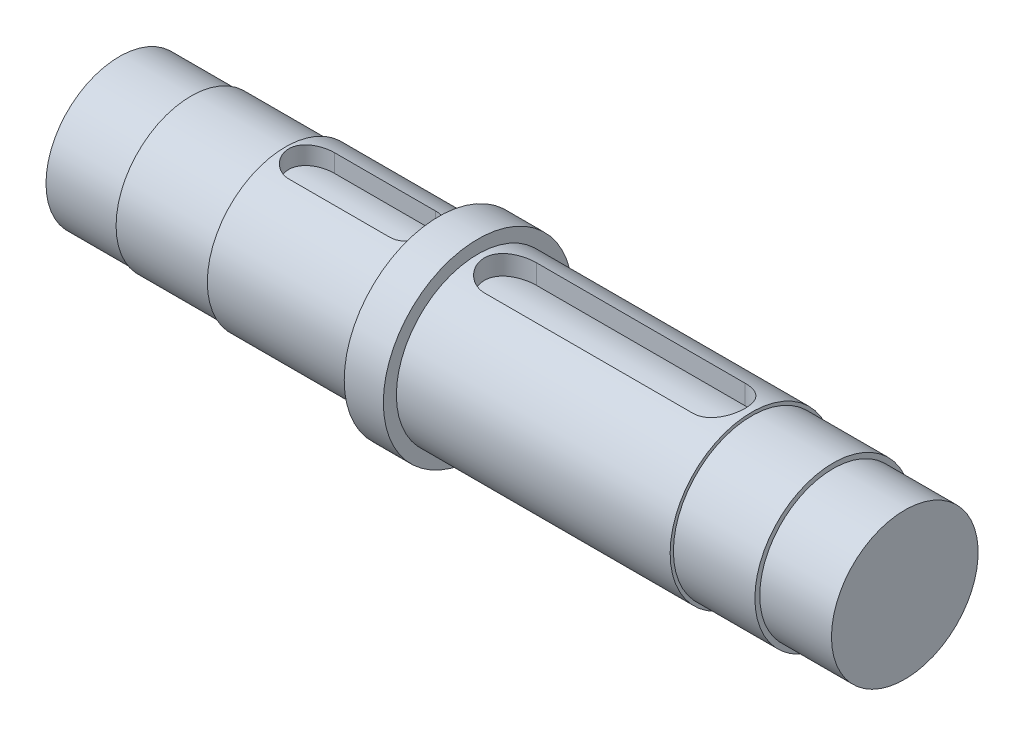
ISO-10303-21;
HEADER;
FILE_DESCRIPTION(('STEP AP214'),'2;1');
FILE_NAME('part.step','',(''),(''),'','','');
FILE_SCHEMA(('AUTOMOTIVE_DESIGN { 1 0 10303 214 1 1 1 1 }'));
ENDSEC;
DATA;
#1=APPLICATION_CONTEXT('core data for automotive mechanical design processes');
#2=APPLICATION_PROTOCOL_DEFINITION('international standard','automotive_design',2000,#1);
#3=PRODUCT_CONTEXT('',#1,'mechanical');
#4=PRODUCT('Part','Part','',(#3));
#5=PRODUCT_RELATED_PRODUCT_CATEGORY('part','',(#4));
#6=PRODUCT_DEFINITION_FORMATION('','',#4);
#7=PRODUCT_DEFINITION_CONTEXT('part definition',#1,'design');
#8=PRODUCT_DEFINITION('design','',#6,#7);
#9=PRODUCT_DEFINITION_SHAPE('','',#8);
#10=(LENGTH_UNIT() NAMED_UNIT(*) SI_UNIT(.MILLI.,.METRE.));
#11=(NAMED_UNIT(*) PLANE_ANGLE_UNIT() SI_UNIT($,.RADIAN.));
#12=(NAMED_UNIT(*) SI_UNIT($,.STERADIAN.) SOLID_ANGLE_UNIT());
#13=UNCERTAINTY_MEASURE_WITH_UNIT(LENGTH_MEASURE(1.E-05),#10,'distance_accuracy_value','');
#14=(GEOMETRIC_REPRESENTATION_CONTEXT(3) GLOBAL_UNCERTAINTY_ASSIGNED_CONTEXT((#13)) GLOBAL_UNIT_ASSIGNED_CONTEXT((#10,
#11,#12)) REPRESENTATION_CONTEXT('',''));
#15=CARTESIAN_POINT('',(0.,0.,0.));
#16=DIRECTION('',(0.,0.,1.));
#17=DIRECTION('',(1.,0.,0.));
#18=AXIS2_PLACEMENT_3D('',#15,#16,#17);
#19=CARTESIAN_POINT('',(-91.2740565726129,0.,0.));
#20=DIRECTION('',(-1.,0.,0.));
#21=DIRECTION('',(0.,0.,1.));
#22=AXIS2_PLACEMENT_3D('',#19,#20,#21);
#23=CYLINDRICAL_SURFACE('',#22,24.);
#24=CARTESIAN_POINT('',(95.,0.,0.));
#25=DIRECTION('',(-1.,0.,0.));
#26=DIRECTION('',(0.,0.,1.));
#27=AXIS2_PLACEMENT_3D('',#24,#25,#26);
#28=CIRCLE('',#27,24.);
#29=CARTESIAN_POINT('',(95.,0.,24.));
#30=VERTEX_POINT('',#29);
#31=EDGE_CURVE('E331',#30,#30,#28,.T.);
#32=ORIENTED_EDGE('',*,*,#31,.T.);
#33=EDGE_LOOP('',(#32));
#34=FACE_BOUND('',#33,.T.);
#35=CARTESIAN_POINT('',(48.,0.,0.));
#36=DIRECTION('',(-1.,0.,0.));
#37=DIRECTION('',(0.,0.,1.));
#38=AXIS2_PLACEMENT_3D('',#35,#36,#37);
#39=CIRCLE('',#38,24.);
#40=CARTESIAN_POINT('',(48.,0.,24.));
#41=VERTEX_POINT('',#40);
#42=EDGE_CURVE('E340',#41,#41,#39,.T.);
#43=ORIENTED_EDGE('',*,*,#42,.F.);
#44=EDGE_LOOP('',(#43));
#45=FACE_BOUND('',#44,.T.);
#46=CARTESIAN_POINT('',(87.,22.956480566498,7.));
#47=CARTESIAN_POINT('',(87.9301846172722,22.956480566498,7.));
#48=CARTESIAN_POINT('',(88.842386550896,23.0149523823366,6.81509831079665));
#49=CARTESIAN_POINT('',(90.5347737208252,23.2118131608828,6.11108238623154));
#50=CARTESIAN_POINT('',(91.3077238076955,23.3487244542818,5.59170049891049));
#51=CARTESIAN_POINT('',(93.232977754885,23.7544902838863,3.66665839678557));
#52=CARTESIAN_POINT('',(93.9982160469547,23.9994796805852,1.84390879715609));
#53=CARTESIAN_POINT('',(94.0008870442569,24.0002587211302,-0.911777092593127));
#54=CARTESIAN_POINT('',(93.81873573476,23.9453496039411,-1.83118730217381));
#55=CARTESIAN_POINT('',(93.1129221296412,23.7539981392087,-3.53278742540199));
#56=CARTESIAN_POINT('',(92.5976003946243,23.6206292552158,-4.30146042356392));
#57=CARTESIAN_POINT('',(90.6590206407036,23.2119024852969,-6.24134086270295));
#58=CARTESIAN_POINT('',(88.8604754628632,22.956480566498,-7.));
#59=CARTESIAN_POINT('',(87.,22.956480566498,-7.));
#60=B_SPLINE_CURVE_WITH_KNOTS('',3,(#46,#47,#48,#49,#50,#51,#52,#53,#54,#55,#56,#57,#58,#59),
.UNSPECIFIED.,.F.,.F.,(4,2,2,2,2,2,4),(0.,0.125,0.25,0.500000000000001,0.625000000000001,
0.750000000000001,1.),.UNSPECIFIED.);
#61=CARTESIAN_POINT('',(87.,22.956480566498,7.));
#62=VERTEX_POINT('',#61);
#63=CARTESIAN_POINT('',(87.,22.956480566498,-7.));
#64=VERTEX_POINT('',#63);
#65=EDGE_CURVE('E457',#62,#64,#60,.T.);
#66=ORIENTED_EDGE('',*,*,#65,.F.);
#67=DIRECTION('',(-1.,0.,0.));
#68=VECTOR('',#67,1.);
#69=CARTESIAN_POINT('',(-91.2740565726129,22.956480566498,7.));
#70=LINE('',#69,#68);
#71=CARTESIAN_POINT('',(56.,22.956480566498,7.));
#72=VERTEX_POINT('',#71);
#73=EDGE_CURVE('E307',#62,#72,#70,.T.);
#74=ORIENTED_EDGE('',*,*,#73,.T.);
#75=CARTESIAN_POINT('',(56.,22.956480566498,-7.));
#76=CARTESIAN_POINT('',(55.0698153827278,22.956480566498,-7.));
#77=CARTESIAN_POINT('',(54.157613449104,23.0149523823366,-6.81509831079665));
#78=CARTESIAN_POINT('',(52.4652262791748,23.2118131608828,-6.11108238623154));
#79=CARTESIAN_POINT('',(51.6922761923045,23.3487244542818,-5.59170049891049));
#80=CARTESIAN_POINT('',(49.767022245115,23.7544902838863,-3.66665839678557));
#81=CARTESIAN_POINT('',(49.0017839530452,23.9994796805852,-1.84390879715608));
#82=CARTESIAN_POINT('',(48.9991129557431,24.0002587211302,0.911777092593132));
#83=CARTESIAN_POINT('',(49.18126426524,23.9453496039411,1.83118730217382));
#84=CARTESIAN_POINT('',(49.8870778703588,23.7539981392086,3.532787425402));
#85=CARTESIAN_POINT('',(50.4023996053757,23.6206292552158,4.30146042356393));
#86=CARTESIAN_POINT('',(52.3409793592964,23.2119024852969,6.24134086270295));
#87=CARTESIAN_POINT('',(54.1395245371367,22.956480566498,7.));
#88=CARTESIAN_POINT('',(56.,22.956480566498,7.));
#89=B_SPLINE_CURVE_WITH_KNOTS('',3,(#75,#76,#77,#78,#79,#80,#81,#82,#83,#84,#85,#86,#87,#88),
.UNSPECIFIED.,.F.,.F.,(4,2,2,2,2,2,4),(0.,0.125,0.25,0.5,0.625,0.75,1.),.UNSPECIFIED.);
#90=CARTESIAN_POINT('',(56.,22.956480566498,-7.));
#91=VERTEX_POINT('',#90);
#92=EDGE_CURVE('E69',#91,#72,#89,.T.);
#93=ORIENTED_EDGE('',*,*,#92,.F.);
#94=DIRECTION('',(-1.,0.,0.));
#95=VECTOR('',#94,1.);
#96=CARTESIAN_POINT('',(-91.2740565726129,22.956480566498,-7.));
#97=LINE('',#96,#95);
#98=EDGE_CURVE('E256',#64,#91,#97,.T.);
#99=ORIENTED_EDGE('',*,*,#98,.F.);
#100=EDGE_LOOP('',(#66,#74,#93,#99));
#101=FACE_BOUND('',#100,.T.);
#102=ADVANCED_FACE('F43',(#34,#45,#101),#23,.T.);
#103=CARTESIAN_POINT('',(19.,22.5,0.));
#104=DIRECTION('',(1.,0.,0.));
#105=DIRECTION('',(0.,0.,-1.));
#106=AXIS2_PLACEMENT_3D('',#103,#104,#105);
#107=PLANE('',#106);
#108=CARTESIAN_POINT('',(19.,0.,0.));
#109=DIRECTION('',(-1.,0.,0.));
#110=DIRECTION('',(0.,0.,1.));
#111=AXIS2_PLACEMENT_3D('',#108,#109,#110);
#112=CIRCLE('',#111,22.5);
#113=CARTESIAN_POINT('',(19.,0.,22.5));
#114=VERTEX_POINT('',#113);
#115=EDGE_CURVE('E301',#114,#114,#112,.T.);
#116=ORIENTED_EDGE('',*,*,#115,.F.);
#117=EDGE_LOOP('',(#116));
#118=FACE_BOUND('',#117,.T.);
#119=CARTESIAN_POINT('',(19.,0.,0.));
#120=DIRECTION('',(-1.,0.,0.));
#121=DIRECTION('',(0.,0.,1.));
#122=AXIS2_PLACEMENT_3D('',#119,#120,#121);
#123=CIRCLE('',#122,23.);
#124=CARTESIAN_POINT('',(19.,0.,23.));
#125=VERTEX_POINT('',#124);
#126=EDGE_CURVE('E11',#125,#125,#123,.T.);
#127=ORIENTED_EDGE('',*,*,#126,.T.);
#128=EDGE_LOOP('',(#127));
#129=FACE_BOUND('',#128,.T.);
#130=ADVANCED_FACE('F44',(#118,#129),#107,.F.);
#131=CARTESIAN_POINT('',(-91.2740565726129,0.,0.));
#132=DIRECTION('',(-1.,0.,0.));
#133=DIRECTION('',(0.,0.,1.));
#134=AXIS2_PLACEMENT_3D('',#131,#132,#133);
#135=CYLINDRICAL_SURFACE('',#134,23.);
#136=ORIENTED_EDGE('',*,*,#126,.F.);
#137=EDGE_LOOP('',(#136));
#138=FACE_BOUND('',#137,.T.);
#139=CARTESIAN_POINT('',(48.,0.,0.));
#140=DIRECTION('',(-1.,0.,0.));
#141=DIRECTION('',(0.,0.,1.));
#142=AXIS2_PLACEMENT_3D('',#139,#140,#141);
#143=CIRCLE('',#142,23.);
#144=CARTESIAN_POINT('',(48.,0.,23.));
#145=VERTEX_POINT('',#144);
#146=EDGE_CURVE('E53',#145,#145,#143,.T.);
#147=ORIENTED_EDGE('',*,*,#146,.T.);
#148=EDGE_LOOP('',(#147));
#149=FACE_BOUND('',#148,.T.);
#150=ADVANCED_FACE('F443',(#138,#149),#135,.T.);
#151=CARTESIAN_POINT('',(48.,23.,0.));
#152=DIRECTION('',(1.,0.,0.));
#153=DIRECTION('',(0.,0.,-1.));
#154=AXIS2_PLACEMENT_3D('',#151,#152,#153);
#155=PLANE('',#154);
#156=ORIENTED_EDGE('',*,*,#146,.F.);
#157=EDGE_LOOP('',(#156));
#158=FACE_BOUND('',#157,.T.);
#159=ORIENTED_EDGE('',*,*,#42,.T.);
#160=EDGE_LOOP('',(#159));
#161=FACE_BOUND('',#160,.T.);
#162=ADVANCED_FACE('F365',(#158,#161),#155,.F.);
#163=CARTESIAN_POINT('',(95.,24.,0.));
#164=DIRECTION('',(1.,0.,0.));
#165=DIRECTION('',(0.,0.,-1.));
#166=AXIS2_PLACEMENT_3D('',#163,#164,#165);
#167=PLANE('',#166);
#168=ORIENTED_EDGE('',*,*,#31,.F.);
#169=EDGE_LOOP('',(#168));
#170=FACE_BOUND('',#169,.T.);
#171=CARTESIAN_POINT('',(95.,0.,0.));
#172=DIRECTION('',(-1.,0.,0.));
#173=DIRECTION('',(0.,0.,1.));
#174=AXIS2_PLACEMENT_3D('',#171,#172,#173);
#175=CIRCLE('',#174,29.);
#176=CARTESIAN_POINT('',(95.,0.,29.));
#177=VERTEX_POINT('',#176);
#178=EDGE_CURVE('E332',#177,#177,#175,.T.);
#179=ORIENTED_EDGE('',*,*,#178,.T.);
#180=EDGE_LOOP('',(#179));
#181=FACE_BOUND('',#180,.T.);
#182=ADVANCED_FACE('F362',(#170,#181),#167,.F.);
#183=CARTESIAN_POINT('',(-91.2740565726129,0.,0.));
#184=DIRECTION('',(-1.,0.,0.));
#185=DIRECTION('',(0.,0.,1.));
#186=AXIS2_PLACEMENT_3D('',#183,#184,#185);
#187=CYLINDRICAL_SURFACE('',#186,29.);
#188=ORIENTED_EDGE('',*,*,#178,.F.);
#189=EDGE_LOOP('',(#188));
#190=FACE_BOUND('',#189,.T.);
#191=CARTESIAN_POINT('',(107.,0.,0.));
#192=DIRECTION('',(-1.,0.,0.));
#193=DIRECTION('',(0.,0.,1.));
#194=AXIS2_PLACEMENT_3D('',#191,#192,#193);
#195=CIRCLE('',#194,29.);
#196=CARTESIAN_POINT('',(107.,0.,29.));
#197=VERTEX_POINT('',#196);
#198=EDGE_CURVE('E327',#197,#197,#195,.T.);
#199=ORIENTED_EDGE('',*,*,#198,.T.);
#200=EDGE_LOOP('',(#199));
#201=FACE_BOUND('',#200,.T.);
#202=ADVANCED_FACE('F388',(#190,#201),#187,.T.);
#203=CARTESIAN_POINT('',(107.,29.,0.));
#204=DIRECTION('',(-1.,0.,0.));
#205=DIRECTION('',(0.,0.,1.));
#206=AXIS2_PLACEMENT_3D('',#203,#204,#205);
#207=PLANE('',#206);
#208=ORIENTED_EDGE('',*,*,#198,.F.);
#209=EDGE_LOOP('',(#208));
#210=FACE_BOUND('',#209,.T.);
#211=CARTESIAN_POINT('',(107.,0.,0.));
#212=DIRECTION('',(-1.,0.,0.));
#213=DIRECTION('',(0.,0.,1.));
#214=AXIS2_PLACEMENT_3D('',#211,#212,#213);
#215=CIRCLE('',#214,25.);
#216=CARTESIAN_POINT('',(107.,0.,25.));
#217=VERTEX_POINT('',#216);
#218=EDGE_CURVE('E324',#217,#217,#215,.T.);
#219=ORIENTED_EDGE('',*,*,#218,.T.);
#220=EDGE_LOOP('',(#219));
#221=FACE_BOUND('',#220,.T.);
#222=ADVANCED_FACE('F387',(#210,#221),#207,.F.);
#223=CARTESIAN_POINT('',(-91.2740565726129,0.,0.));
#224=DIRECTION('',(-1.,0.,0.));
#225=DIRECTION('',(0.,0.,1.));
#226=AXIS2_PLACEMENT_3D('',#223,#224,#225);
#227=CYLINDRICAL_SURFACE('',#226,25.);
#228=CARTESIAN_POINT('',(181.,23.685438564654,8.));
#229=CARTESIAN_POINT('',(182.064380904419,23.685438564654,8.));
#230=CARTESIAN_POINT('',(183.107977599322,23.7597254239238,7.78799696545186));
#231=CARTESIAN_POINT('',(185.041372596679,24.0086166849778,6.98310631652881));
#232=CARTESIAN_POINT('',(185.923773757206,24.1813126538883,6.38979539570391));
#233=CARTESIAN_POINT('',(187.388858922403,24.5216200929571,4.92498882036706));
#234=CARTESIAN_POINT('',(187.983799520792,24.6906305921373,4.03863451830264));
#235=CARTESIAN_POINT('',(188.784870719125,24.9290592563029,2.11655673336485));
#236=CARTESIAN_POINT('',(188.998912231546,24.9996519142604,1.05946938255356));
#237=CARTESIAN_POINT('',(189.001079269364,25.0003453660315,-1.04297784535445));
#238=CARTESIAN_POINT('',(188.792619047752,24.931428604756,-2.0941718276419));
#239=CARTESIAN_POINT('',(187.984517381224,24.690781755531,-4.04066630872539));
#240=CARTESIAN_POINT('',(187.395286357912,24.5231727094609,-4.91801948078359));
#241=CARTESIAN_POINT('',(185.184619924219,24.0095042111152,-7.12989263187689));
#242=CARTESIAN_POINT('',(183.128950637876,23.685438564654,-8.));
#243=CARTESIAN_POINT('',(181.,23.685438564654,-8.));
#244=B_SPLINE_CURVE_WITH_KNOTS('',3,(#228,#229,#230,#231,#232,#233,#234,#235,#236,#237,#238,
#239,#240,#241,#242,#243),.UNSPECIFIED.,.F.,.F.,(4,2,2,2,2,2,2,4),(0.,0.125,0.250000000000001,
0.375000000000001,0.500000000000001,0.625000000000002,0.750000000000002,1.),.UNSPECIFIED.);
#245=CARTESIAN_POINT('',(181.,23.685438564654,8.));
#246=VERTEX_POINT('',#245);
#247=CARTESIAN_POINT('',(181.,23.685438564654,-8.));
#248=VERTEX_POINT('',#247);
#249=EDGE_CURVE('E113',#246,#248,#244,.T.);
#250=ORIENTED_EDGE('',*,*,#249,.F.);
#251=DIRECTION('',(-1.,0.,0.));
#252=VECTOR('',#251,1.);
#253=CARTESIAN_POINT('',(-91.2740565726129,23.685438564654,8.));
#254=LINE('',#253,#252);
#255=CARTESIAN_POINT('',(117.,23.685438564654,8.));
#256=VERTEX_POINT('',#255);
#257=EDGE_CURVE('E489',#246,#256,#254,.T.);
#258=ORIENTED_EDGE('',*,*,#257,.T.);
#259=CARTESIAN_POINT('',(117.,23.685438564654,-8.));
#260=CARTESIAN_POINT('',(115.935619095581,23.685438564654,-8.));
#261=CARTESIAN_POINT('',(114.892022400678,23.7597254239238,-7.78799696545185));
#262=CARTESIAN_POINT('',(112.958627403321,24.0086166849778,-6.98310631652881));
#263=CARTESIAN_POINT('',(112.076226242794,24.1813126538883,-6.38979539570391));
#264=CARTESIAN_POINT('',(110.611141077597,24.5216200929571,-4.92498882036706));
#265=CARTESIAN_POINT('',(110.016200479208,24.6906305921373,-4.03863451830264));
#266=CARTESIAN_POINT('',(109.215129280875,24.9290592563029,-2.11655673336484));
#267=CARTESIAN_POINT('',(109.001087768454,24.9996519142604,-1.05946938255356));
#268=CARTESIAN_POINT('',(108.998920730636,25.0003453660315,1.04297784535445));
#269=CARTESIAN_POINT('',(109.207380952247,24.9314286047559,2.0941718276419));
#270=CARTESIAN_POINT('',(110.015482618776,24.690781755531,4.0406663087254));
#271=CARTESIAN_POINT('',(110.604713642088,24.5231727094609,4.91801948078359));
#272=CARTESIAN_POINT('',(112.815380075781,24.0095042111152,7.12989263187689));
#273=CARTESIAN_POINT('',(114.871049362124,23.685438564654,8.));
#274=CARTESIAN_POINT('',(117.,23.685438564654,8.));
#275=B_SPLINE_CURVE_WITH_KNOTS('',3,(#259,#260,#261,#262,#263,#264,#265,#266,#267,#268,#269,
#270,#271,#272,#273,#274),.UNSPECIFIED.,.F.,.F.,(4,2,2,2,2,2,2,4),(0.,0.125,0.25,0.375,0.5,
0.625,0.75,1.),.UNSPECIFIED.);
#276=CARTESIAN_POINT('',(117.,23.685438564654,-8.));
#277=VERTEX_POINT('',#276);
#278=EDGE_CURVE('E137',#277,#256,#275,.T.);
#279=ORIENTED_EDGE('',*,*,#278,.F.);
#280=DIRECTION('',(-1.,0.,0.));
#281=VECTOR('',#280,1.);
#282=CARTESIAN_POINT('',(-91.2740565726129,23.685438564654,-8.));
#283=LINE('',#282,#281);
#284=EDGE_CURVE('E135',#248,#277,#283,.T.);
#285=ORIENTED_EDGE('',*,*,#284,.F.);
#286=EDGE_LOOP('',(#250,#258,#279,#285));
#287=FACE_BOUND('',#286,.T.);
#288=ORIENTED_EDGE('',*,*,#218,.F.);
#289=EDGE_LOOP('',(#288));
#290=FACE_BOUND('',#289,.T.);
#291=CARTESIAN_POINT('',(191.,0.,0.));
#292=DIRECTION('',(-1.,0.,0.));
#293=DIRECTION('',(0.,0.,1.));
#294=AXIS2_PLACEMENT_3D('',#291,#292,#293);
#295=CIRCLE('',#294,25.);
#296=CARTESIAN_POINT('',(191.,0.,25.));
#297=VERTEX_POINT('',#296);
#298=EDGE_CURVE('E325',#297,#297,#295,.T.);
#299=ORIENTED_EDGE('',*,*,#298,.T.);
#300=EDGE_LOOP('',(#299));
#301=FACE_BOUND('',#300,.T.);
#302=ADVANCED_FACE('F140',(#287,#290,#301),#227,.T.);
#303=CARTESIAN_POINT('',(191.,25.,0.));
#304=DIRECTION('',(-1.,0.,0.));
#305=DIRECTION('',(0.,0.,1.));
#306=AXIS2_PLACEMENT_3D('',#303,#304,#305);
#307=PLANE('',#306);
#308=ORIENTED_EDGE('',*,*,#298,.F.);
#309=EDGE_LOOP('',(#308));
#310=FACE_BOUND('',#309,.T.);
#311=CARTESIAN_POINT('',(191.,0.,0.));
#312=DIRECTION('',(-1.,0.,0.));
#313=DIRECTION('',(0.,0.,1.));
#314=AXIS2_PLACEMENT_3D('',#311,#312,#313);
#315=CIRCLE('',#314,24.);
#316=CARTESIAN_POINT('',(191.,0.,24.));
#317=VERTEX_POINT('',#316);
#318=EDGE_CURVE('E317',#317,#317,#315,.T.);
#319=ORIENTED_EDGE('',*,*,#318,.T.);
#320=EDGE_LOOP('',(#319));
#321=FACE_BOUND('',#320,.T.);
#322=ADVANCED_FACE('F384',(#310,#321),#307,.F.);
#323=CARTESIAN_POINT('',(-91.2740565726129,0.,0.));
#324=DIRECTION('',(-1.,0.,0.));
#325=DIRECTION('',(0.,0.,1.));
#326=AXIS2_PLACEMENT_3D('',#323,#324,#325);
#327=CYLINDRICAL_SURFACE('',#326,24.);
#328=ORIENTED_EDGE('',*,*,#318,.F.);
#329=EDGE_LOOP('',(#328));
#330=FACE_BOUND('',#329,.T.);
#331=CARTESIAN_POINT('',(216.,0.,0.));
#332=DIRECTION('',(-1.,0.,0.));
#333=DIRECTION('',(0.,0.,1.));
#334=AXIS2_PLACEMENT_3D('',#331,#332,#333);
#335=CIRCLE('',#334,24.);
#336=CARTESIAN_POINT('',(216.,0.,24.));
#337=VERTEX_POINT('',#336);
#338=EDGE_CURVE('E316',#337,#337,#335,.T.);
#339=ORIENTED_EDGE('',*,*,#338,.T.);
#340=EDGE_LOOP('',(#339));
#341=FACE_BOUND('',#340,.T.);
#342=ADVANCED_FACE('F406',(#330,#341),#327,.T.);
#343=CARTESIAN_POINT('',(216.,24.,0.));
#344=DIRECTION('',(-1.,0.,0.));
#345=DIRECTION('',(0.,0.,1.));
#346=AXIS2_PLACEMENT_3D('',#343,#344,#345);
#347=PLANE('',#346);
#348=ORIENTED_EDGE('',*,*,#338,.F.);
#349=EDGE_LOOP('',(#348));
#350=FACE_BOUND('',#349,.T.);
#351=CARTESIAN_POINT('',(216.,0.,0.));
#352=DIRECTION('',(-1.,0.,0.));
#353=DIRECTION('',(0.,0.,1.));
#354=AXIS2_PLACEMENT_3D('',#351,#352,#353);
#355=CIRCLE('',#354,22.5);
#356=CARTESIAN_POINT('',(216.,0.,22.5));
#357=VERTEX_POINT('',#356);
#358=EDGE_CURVE('E311',#357,#357,#355,.T.);
#359=ORIENTED_EDGE('',*,*,#358,.T.);
#360=EDGE_LOOP('',(#359));
#361=FACE_BOUND('',#360,.T.);
#362=ADVANCED_FACE('F411',(#350,#361),#347,.F.);
#363=CARTESIAN_POINT('',(-91.2740565726129,0.,0.));
#364=DIRECTION('',(-1.,0.,0.));
#365=DIRECTION('',(0.,0.,1.));
#366=AXIS2_PLACEMENT_3D('',#363,#364,#365);
#367=CYLINDRICAL_SURFACE('',#366,22.5);
#368=ORIENTED_EDGE('',*,*,#358,.F.);
#369=EDGE_LOOP('',(#368));
#370=FACE_BOUND('',#369,.T.);
#371=CARTESIAN_POINT('',(238.,0.,0.));
#372=DIRECTION('',(-1.,0.,0.));
#373=DIRECTION('',(0.,0.,1.));
#374=AXIS2_PLACEMENT_3D('',#371,#372,#373);
#375=CIRCLE('',#374,22.5);
#376=CARTESIAN_POINT('',(238.,0.,22.5));
#377=VERTEX_POINT('',#376);
#378=EDGE_CURVE('E309',#377,#377,#375,.T.);
#379=ORIENTED_EDGE('',*,*,#378,.T.);
#380=EDGE_LOOP('',(#379));
#381=FACE_BOUND('',#380,.T.);
#382=ADVANCED_FACE('F416',(#370,#381),#367,.T.);
#383=CARTESIAN_POINT('',(238.,22.5,0.));
#384=DIRECTION('',(-1.,0.,0.));
#385=DIRECTION('',(0.,0.,1.));
#386=AXIS2_PLACEMENT_3D('',#383,#384,#385);
#387=PLANE('',#386);
#388=ORIENTED_EDGE('',*,*,#378,.F.);
#389=EDGE_LOOP('',(#388));
#390=FACE_BOUND('',#389,.T.);
#391=ADVANCED_FACE('F424',(#390),#387,.F.);
#392=CARTESIAN_POINT('',(-3.00000000000001,22.5,0.));
#393=DIRECTION('',(1.,0.,0.));
#394=DIRECTION('',(0.,0.,-1.));
#395=AXIS2_PLACEMENT_3D('',#392,#393,#394);
#396=PLANE('',#395);
#397=CARTESIAN_POINT('',(-3.,0.,0.));
#398=DIRECTION('',(-1.,0.,0.));
#399=DIRECTION('',(0.,0.,1.));
#400=AXIS2_PLACEMENT_3D('',#397,#398,#399);
#401=CIRCLE('',#400,22.5);
#402=CARTESIAN_POINT('',(-3.,0.,22.5));
#403=VERTEX_POINT('',#402);
#404=EDGE_CURVE('E308',#403,#403,#401,.T.);
#405=ORIENTED_EDGE('',*,*,#404,.T.);
#406=EDGE_LOOP('',(#405));
#407=FACE_BOUND('',#406,.T.);
#408=ADVANCED_FACE('F427',(#407),#396,.F.);
#409=CARTESIAN_POINT('',(-91.2740565726129,0.,0.));
#410=DIRECTION('',(-1.,0.,0.));
#411=DIRECTION('',(0.,0.,1.));
#412=AXIS2_PLACEMENT_3D('',#409,#410,#411);
#413=CYLINDRICAL_SURFACE('',#412,22.5);
#414=ORIENTED_EDGE('',*,*,#404,.F.);
#415=EDGE_LOOP('',(#414));
#416=FACE_BOUND('',#415,.T.);
#417=ORIENTED_EDGE('',*,*,#115,.T.);
#418=EDGE_LOOP('',(#417));
#419=FACE_BOUND('',#418,.T.);
#420=ADVANCED_FACE('F280',(#416,#419),#413,.T.);
#421=CARTESIAN_POINT('',(-91.2740565726129,-5.5,0.));
#422=DIRECTION('',(-1.,0.,0.));
#423=DIRECTION('',(0.,0.,1.));
#424=AXIS2_PLACEMENT_3D('',#421,#422,#423);
#425=CYLINDRICAL_SURFACE('',#424,24.);
#426=CARTESIAN_POINT('',(87.,17.456480566498,-7.));
#427=CARTESIAN_POINT('',(88.8604754628632,17.456480566498,-7.));
#428=CARTESIAN_POINT('',(90.6590206407036,17.7119024852969,-6.24134086270295));
#429=CARTESIAN_POINT('',(92.5976003946243,18.1206292552158,-4.30146042356392));
#430=CARTESIAN_POINT('',(93.1129221296412,18.2539981392087,-3.53278742540199));
#431=CARTESIAN_POINT('',(93.81873573476,18.4453496039411,-1.83118730217381));
#432=CARTESIAN_POINT('',(94.0008870442569,18.5002587211302,-0.911777092593127));
#433=CARTESIAN_POINT('',(93.9982160469547,18.4994796805852,1.84390879715609));
#434=CARTESIAN_POINT('',(93.232977754885,18.2544902838863,3.66665839678557));
#435=CARTESIAN_POINT('',(91.3077238076955,17.8487244542818,5.59170049891049));
#436=CARTESIAN_POINT('',(90.5347737208252,17.7118131608828,6.11108238623154));
#437=CARTESIAN_POINT('',(88.842386550896,17.5149523823366,6.81509831079665));
#438=CARTESIAN_POINT('',(87.9301846172722,17.456480566498,7.));
#439=CARTESIAN_POINT('',(87.,17.456480566498,7.));
#440=B_SPLINE_CURVE_WITH_KNOTS('',3,(#426,#427,#428,#429,#430,#431,#432,#433,#434,#435,#436,
#437,#438,#439),.UNSPECIFIED.,.F.,.F.,(4,2,2,2,2,2,4),(0.,0.249999999999999,0.374999999999999,
0.499999999999999,0.75,0.875,1.),.UNSPECIFIED.);
#441=CARTESIAN_POINT('',(87.,17.456480566498,7.));
#442=VERTEX_POINT('',#441);
#443=CARTESIAN_POINT('',(87.,17.456480566498,-7.));
#444=VERTEX_POINT('',#443);
#445=EDGE_CURVE('E127',#442,#444,#440,.F.);
#446=ORIENTED_EDGE('',*,*,#445,.T.);
#447=DIRECTION('',(-1.,0.,0.));
#448=VECTOR('',#447,1.);
#449=CARTESIAN_POINT('',(-91.2740565726129,17.456480566498,-7.));
#450=LINE('',#449,#448);
#451=CARTESIAN_POINT('',(56.,17.456480566498,-7.));
#452=VERTEX_POINT('',#451);
#453=EDGE_CURVE('E253',#444,#452,#450,.T.);
#454=ORIENTED_EDGE('',*,*,#453,.T.);
#455=CARTESIAN_POINT('',(56.,17.456480566498,7.));
#456=CARTESIAN_POINT('',(54.1395245371367,17.456480566498,7.));
#457=CARTESIAN_POINT('',(52.3409793592964,17.7119024852969,6.24134086270295));
#458=CARTESIAN_POINT('',(50.4023996053757,18.1206292552158,4.30146042356393));
#459=CARTESIAN_POINT('',(49.8870778703588,18.2539981392086,3.532787425402));
#460=CARTESIAN_POINT('',(49.18126426524,18.4453496039411,1.83118730217382));
#461=CARTESIAN_POINT('',(48.9991129557431,18.5002587211302,0.911777092593132));
#462=CARTESIAN_POINT('',(49.0017839530452,18.4994796805852,-1.84390879715608));
#463=CARTESIAN_POINT('',(49.767022245115,18.2544902838863,-3.66665839678557));
#464=CARTESIAN_POINT('',(51.6922761923045,17.8487244542818,-5.59170049891049));
#465=CARTESIAN_POINT('',(52.4652262791748,17.7118131608828,-6.11108238623154));
#466=CARTESIAN_POINT('',(54.157613449104,17.5149523823366,-6.81509831079665));
#467=CARTESIAN_POINT('',(55.0698153827278,17.456480566498,-7.));
#468=CARTESIAN_POINT('',(56.,17.456480566498,-7.));
#469=B_SPLINE_CURVE_WITH_KNOTS('',3,(#455,#456,#457,#458,#459,#460,#461,#462,#463,#464,#465,
#466,#467,#468),.UNSPECIFIED.,.F.,.F.,(4,2,2,2,2,2,4),(0.,0.25,0.375,0.5,0.75,0.875,1.),.UNSPECIFIED.);
#470=CARTESIAN_POINT('',(56.,17.456480566498,7.));
#471=VERTEX_POINT('',#470);
#472=EDGE_CURVE('E478',#452,#471,#469,.F.);
#473=ORIENTED_EDGE('',*,*,#472,.T.);
#474=DIRECTION('',(-1.,0.,0.));
#475=VECTOR('',#474,1.);
#476=CARTESIAN_POINT('',(-91.2740565726129,17.456480566498,7.));
#477=LINE('',#476,#475);
#478=EDGE_CURVE('E264',#442,#471,#477,.T.);
#479=ORIENTED_EDGE('',*,*,#478,.F.);
#480=EDGE_LOOP('',(#446,#454,#473,#479));
#481=FACE_BOUND('',#480,.T.);
#482=ADVANCED_FACE('F189',(#481),#425,.T.);
#483=CARTESIAN_POINT('',(87.,22.956480566498,7.));
#484=CARTESIAN_POINT('',(87.9301846172722,22.956480566498,7.));
#485=CARTESIAN_POINT('',(88.842386550896,23.0149523823366,6.81509831079665));
#486=CARTESIAN_POINT('',(90.5347737208252,23.2118131608828,6.11108238623154));
#487=CARTESIAN_POINT('',(91.3077238076955,23.3487244542818,5.59170049891049));
#488=CARTESIAN_POINT('',(93.232977754885,23.7544902838863,3.66665839678557));
#489=CARTESIAN_POINT('',(93.9982160469547,23.9994796805852,1.84390879715609));
#490=CARTESIAN_POINT('',(94.0008870442569,24.0002587211302,-0.911777092593127));
#491=CARTESIAN_POINT('',(93.81873573476,23.9453496039411,-1.83118730217381));
#492=CARTESIAN_POINT('',(93.1129221296412,23.7539981392087,-3.53278742540199));
#493=CARTESIAN_POINT('',(92.5976003946243,23.6206292552158,-4.30146042356392));
#494=CARTESIAN_POINT('',(90.6590206407036,23.2119024852969,-6.24134086270295));
#495=CARTESIAN_POINT('',(88.8604754628632,22.956480566498,-7.));
#496=CARTESIAN_POINT('',(87.,22.956480566498,-7.));
#497=B_SPLINE_CURVE_WITH_KNOTS('',3,(#483,#484,#485,#486,#487,#488,#489,#490,#491,#492,#493,
#494,#495,#496),.UNSPECIFIED.,.F.,.F.,(4,2,2,2,2,2,4),(0.,0.125,0.25,0.500000000000001,
0.625000000000001,0.750000000000001,1.),.UNSPECIFIED.);
#498=DIRECTION('',(0.,-1.,0.));
#499=VECTOR('',#498,1.);
#500=SURFACE_OF_LINEAR_EXTRUSION('',#497,#499);
#501=ORIENTED_EDGE('',*,*,#445,.F.);
#502=DIRECTION('',(0.,-1.,0.));
#503=VECTOR('',#502,1.);
#504=CARTESIAN_POINT('',(87.,22.956480566498,7.));
#505=LINE('',#504,#503);
#506=EDGE_CURVE('E458',#62,#442,#505,.T.);
#507=ORIENTED_EDGE('',*,*,#506,.F.);
#508=ORIENTED_EDGE('',*,*,#65,.T.);
#509=DIRECTION('',(0.,-1.,0.));
#510=VECTOR('',#509,1.);
#511=CARTESIAN_POINT('',(87.,22.956480566498,-7.));
#512=LINE('',#511,#510);
#513=EDGE_CURVE('E259',#64,#444,#512,.T.);
#514=ORIENTED_EDGE('',*,*,#513,.T.);
#515=EDGE_LOOP('',(#501,#507,#508,#514));
#516=FACE_BOUND('',#515,.T.);
#517=ADVANCED_FACE('F277',(#516),#500,.T.);
#518=CARTESIAN_POINT('',(-91.2740565726129,22.956480566498,-7.));
#519=DIRECTION('',(0.,0.,1.));
#520=DIRECTION('',(1.,0.,0.));
#521=AXIS2_PLACEMENT_3D('',#518,#519,#520);
#522=PLANE('',#521);
#523=ORIENTED_EDGE('',*,*,#453,.F.);
#524=ORIENTED_EDGE('',*,*,#513,.F.);
#525=ORIENTED_EDGE('',*,*,#98,.T.);
#526=DIRECTION('',(0.,-1.,0.));
#527=VECTOR('',#526,1.);
#528=CARTESIAN_POINT('',(56.,22.956480566498,-7.));
#529=LINE('',#528,#527);
#530=EDGE_CURVE('E474',#91,#452,#529,.T.);
#531=ORIENTED_EDGE('',*,*,#530,.T.);
#532=EDGE_LOOP('',(#523,#524,#525,#531));
#533=FACE_BOUND('',#532,.T.);
#534=ADVANCED_FACE('F240',(#533),#522,.T.);
#535=CARTESIAN_POINT('',(56.,22.956480566498,-7.));
#536=CARTESIAN_POINT('',(55.0698153827278,22.956480566498,-7.));
#537=CARTESIAN_POINT('',(54.157613449104,23.0149523823366,-6.81509831079665));
#538=CARTESIAN_POINT('',(52.4652262791748,23.2118131608828,-6.11108238623154));
#539=CARTESIAN_POINT('',(51.6922761923045,23.3487244542818,-5.59170049891049));
#540=CARTESIAN_POINT('',(49.767022245115,23.7544902838863,-3.66665839678557));
#541=CARTESIAN_POINT('',(49.0017839530452,23.9994796805852,-1.84390879715608));
#542=CARTESIAN_POINT('',(48.9991129557431,24.0002587211302,0.911777092593132));
#543=CARTESIAN_POINT('',(49.18126426524,23.9453496039411,1.83118730217382));
#544=CARTESIAN_POINT('',(49.8870778703588,23.7539981392086,3.532787425402));
#545=CARTESIAN_POINT('',(50.4023996053757,23.6206292552158,4.30146042356393));
#546=CARTESIAN_POINT('',(52.3409793592964,23.2119024852969,6.24134086270295));
#547=CARTESIAN_POINT('',(54.1395245371367,22.956480566498,7.));
#548=CARTESIAN_POINT('',(56.,22.956480566498,7.));
#549=B_SPLINE_CURVE_WITH_KNOTS('',3,(#535,#536,#537,#538,#539,#540,#541,#542,#543,#544,#545,
#546,#547,#548),.UNSPECIFIED.,.F.,.F.,(4,2,2,2,2,2,4),(0.,0.125,0.25,0.5,0.625,0.75,1.),.UNSPECIFIED.);
#550=DIRECTION('',(0.,-1.,0.));
#551=VECTOR('',#550,1.);
#552=SURFACE_OF_LINEAR_EXTRUSION('',#549,#551);
#553=ORIENTED_EDGE('',*,*,#472,.F.);
#554=ORIENTED_EDGE('',*,*,#530,.F.);
#555=ORIENTED_EDGE('',*,*,#92,.T.);
#556=DIRECTION('',(0.,-1.,0.));
#557=VECTOR('',#556,1.);
#558=CARTESIAN_POINT('',(56.,22.956480566498,7.));
#559=LINE('',#558,#557);
#560=EDGE_CURVE('E480',#72,#471,#559,.T.);
#561=ORIENTED_EDGE('',*,*,#560,.T.);
#562=EDGE_LOOP('',(#553,#554,#555,#561));
#563=FACE_BOUND('',#562,.T.);
#564=ADVANCED_FACE('F233',(#563),#552,.T.);
#565=CARTESIAN_POINT('',(-91.2740565726129,22.956480566498,7.));
#566=DIRECTION('',(0.,0.,1.));
#567=DIRECTION('',(1.,0.,0.));
#568=AXIS2_PLACEMENT_3D('',#565,#566,#567);
#569=PLANE('',#568);
#570=ORIENTED_EDGE('',*,*,#478,.T.);
#571=ORIENTED_EDGE('',*,*,#560,.F.);
#572=ORIENTED_EDGE('',*,*,#73,.F.);
#573=ORIENTED_EDGE('',*,*,#506,.T.);
#574=EDGE_LOOP('',(#570,#571,#572,#573));
#575=FACE_BOUND('',#574,.T.);
#576=ADVANCED_FACE('F237',(#575),#569,.F.);
#577=CARTESIAN_POINT('',(-91.2740565726129,-6.,0.));
#578=DIRECTION('',(-1.,0.,0.));
#579=DIRECTION('',(0.,0.,1.));
#580=AXIS2_PLACEMENT_3D('',#577,#578,#579);
#581=CYLINDRICAL_SURFACE('',#580,25.);
#582=DIRECTION('',(-1.,0.,0.));
#583=VECTOR('',#582,1.);
#584=CARTESIAN_POINT('',(-91.2740565726129,17.685438564654,8.));
#585=LINE('',#584,#583);
#586=CARTESIAN_POINT('',(181.,17.685438564654,8.));
#587=VERTEX_POINT('',#586);
#588=CARTESIAN_POINT('',(117.,17.685438564654,8.));
#589=VERTEX_POINT('',#588);
#590=EDGE_CURVE('E154',#587,#589,#585,.T.);
#591=ORIENTED_EDGE('',*,*,#590,.F.);
#592=CARTESIAN_POINT('',(181.,17.685438564654,-8.));
#593=CARTESIAN_POINT('',(183.128950637876,17.685438564654,-8.));
#594=CARTESIAN_POINT('',(185.184619924219,18.0095042111152,-7.12989263187689));
#595=CARTESIAN_POINT('',(187.395286357912,18.5231727094609,-4.91801948078359));
#596=CARTESIAN_POINT('',(187.984517381224,18.690781755531,-4.04066630872539));
#597=CARTESIAN_POINT('',(188.792619047752,18.931428604756,-2.0941718276419));
#598=CARTESIAN_POINT('',(189.001079269364,19.0003453660315,-1.04297784535445));
#599=CARTESIAN_POINT('',(188.998912231546,18.9996519142604,1.05946938255356));
#600=CARTESIAN_POINT('',(188.784870719125,18.9290592563029,2.11655673336485));
#601=CARTESIAN_POINT('',(187.983799520792,18.6906305921373,4.03863451830264));
#602=CARTESIAN_POINT('',(187.388858922403,18.5216200929571,4.92498882036706));
#603=CARTESIAN_POINT('',(185.923773757206,18.1813126538883,6.38979539570391));
#604=CARTESIAN_POINT('',(185.041372596679,18.0086166849778,6.98310631652881));
#605=CARTESIAN_POINT('',(183.107977599322,17.7597254239238,7.78799696545186));
#606=CARTESIAN_POINT('',(182.064380904419,17.685438564654,8.));
#607=CARTESIAN_POINT('',(181.,17.685438564654,8.));
#608=B_SPLINE_CURVE_WITH_KNOTS('',3,(#592,#593,#594,#595,#596,#597,#598,#599,#600,#601,#602,
#603,#604,#605,#606,#607),.UNSPECIFIED.,.F.,.F.,(4,2,2,2,2,2,2,4),(0.,0.249999999999998,
0.374999999999998,0.499999999999999,0.624999999999999,0.749999999999999,0.875,1.),.UNSPECIFIED.);
#609=CARTESIAN_POINT('',(181.,17.685438564654,-8.));
#610=VERTEX_POINT('',#609);
#611=EDGE_CURVE('E130',#587,#610,#608,.F.);
#612=ORIENTED_EDGE('',*,*,#611,.T.);
#613=DIRECTION('',(-1.,0.,0.));
#614=VECTOR('',#613,1.);
#615=CARTESIAN_POINT('',(-91.2740565726129,17.685438564654,-8.));
#616=LINE('',#615,#614);
#617=CARTESIAN_POINT('',(117.,17.685438564654,-8.));
#618=VERTEX_POINT('',#617);
#619=EDGE_CURVE('E132',#610,#618,#616,.T.);
#620=ORIENTED_EDGE('',*,*,#619,.T.);
#621=CARTESIAN_POINT('',(117.,17.685438564654,8.));
#622=CARTESIAN_POINT('',(114.871049362124,17.685438564654,8.));
#623=CARTESIAN_POINT('',(112.815380075781,18.0095042111152,7.12989263187689));
#624=CARTESIAN_POINT('',(110.604713642088,18.5231727094609,4.91801948078359));
#625=CARTESIAN_POINT('',(110.015482618776,18.690781755531,4.0406663087254));
#626=CARTESIAN_POINT('',(109.207380952247,18.931428604756,2.0941718276419));
#627=CARTESIAN_POINT('',(108.998920730636,19.0003453660315,1.04297784535445));
#628=CARTESIAN_POINT('',(109.001087768454,18.9996519142604,-1.05946938255356));
#629=CARTESIAN_POINT('',(109.215129280875,18.9290592563029,-2.11655673336484));
#630=CARTESIAN_POINT('',(110.016200479208,18.6906305921373,-4.03863451830264));
#631=CARTESIAN_POINT('',(110.611141077597,18.5216200929571,-4.92498882036706));
#632=CARTESIAN_POINT('',(112.076226242794,18.1813126538883,-6.38979539570391));
#633=CARTESIAN_POINT('',(112.958627403321,18.0086166849778,-6.98310631652881));
#634=CARTESIAN_POINT('',(114.892022400678,17.7597254239238,-7.78799696545185));
#635=CARTESIAN_POINT('',(115.935619095581,17.685438564654,-8.));
#636=CARTESIAN_POINT('',(117.,17.685438564654,-8.));
#637=B_SPLINE_CURVE_WITH_KNOTS('',3,(#621,#622,#623,#624,#625,#626,#627,#628,#629,#630,#631,
#632,#633,#634,#635,#636),.UNSPECIFIED.,.F.,.F.,(4,2,2,2,2,2,2,4),(0.,0.25,0.375,0.5,0.625,0.75,
0.875,1.),.UNSPECIFIED.);
#638=EDGE_CURVE('E211',#618,#589,#637,.F.);
#639=ORIENTED_EDGE('',*,*,#638,.T.);
#640=EDGE_LOOP('',(#591,#612,#620,#639));
#641=FACE_BOUND('',#640,.T.);
#642=ADVANCED_FACE('F166',(#641),#581,.T.);
#643=CARTESIAN_POINT('',(-91.2740565726129,23.685438564654,8.));
#644=DIRECTION('',(0.,0.,1.));
#645=DIRECTION('',(1.,0.,0.));
#646=AXIS2_PLACEMENT_3D('',#643,#644,#645);
#647=PLANE('',#646);
#648=ORIENTED_EDGE('',*,*,#590,.T.);
#649=DIRECTION('',(0.,-1.,0.));
#650=VECTOR('',#649,1.);
#651=CARTESIAN_POINT('',(117.,23.685438564654,8.));
#652=LINE('',#651,#650);
#653=EDGE_CURVE('E495',#256,#589,#652,.T.);
#654=ORIENTED_EDGE('',*,*,#653,.F.);
#655=ORIENTED_EDGE('',*,*,#257,.F.);
#656=DIRECTION('',(0.,-1.,0.));
#657=VECTOR('',#656,1.);
#658=CARTESIAN_POINT('',(181.,23.685438564654,8.));
#659=LINE('',#658,#657);
#660=EDGE_CURVE('E125',#246,#587,#659,.T.);
#661=ORIENTED_EDGE('',*,*,#660,.T.);
#662=EDGE_LOOP('',(#648,#654,#655,#661));
#663=FACE_BOUND('',#662,.T.);
#664=ADVANCED_FACE('F170',(#663),#647,.F.);
#665=CARTESIAN_POINT('',(181.,23.685438564654,8.));
#666=CARTESIAN_POINT('',(182.064380904419,23.685438564654,8.));
#667=CARTESIAN_POINT('',(183.107977599322,23.7597254239238,7.78799696545186));
#668=CARTESIAN_POINT('',(185.041372596679,24.0086166849778,6.98310631652881));
#669=CARTESIAN_POINT('',(185.923773757206,24.1813126538883,6.38979539570391));
#670=CARTESIAN_POINT('',(187.388858922403,24.5216200929571,4.92498882036706));
#671=CARTESIAN_POINT('',(187.983799520792,24.6906305921373,4.03863451830264));
#672=CARTESIAN_POINT('',(188.784870719125,24.9290592563029,2.11655673336485));
#673=CARTESIAN_POINT('',(188.998912231546,24.9996519142604,1.05946938255356));
#674=CARTESIAN_POINT('',(189.001079269364,25.0003453660315,-1.04297784535445));
#675=CARTESIAN_POINT('',(188.792619047752,24.931428604756,-2.0941718276419));
#676=CARTESIAN_POINT('',(187.984517381224,24.690781755531,-4.04066630872539));
#677=CARTESIAN_POINT('',(187.395286357912,24.5231727094609,-4.91801948078359));
#678=CARTESIAN_POINT('',(185.184619924219,24.0095042111152,-7.12989263187689));
#679=CARTESIAN_POINT('',(183.128950637876,23.685438564654,-8.));
#680=CARTESIAN_POINT('',(181.,23.685438564654,-8.));
#681=B_SPLINE_CURVE_WITH_KNOTS('',3,(#665,#666,#667,#668,#669,#670,#671,#672,#673,#674,#675,
#676,#677,#678,#679,#680),.UNSPECIFIED.,.F.,.F.,(4,2,2,2,2,2,2,4),(0.,0.125,0.250000000000001,
0.375000000000001,0.500000000000001,0.625000000000002,0.750000000000002,1.),.UNSPECIFIED.);
#682=DIRECTION('',(0.,-1.,0.));
#683=VECTOR('',#682,1.);
#684=SURFACE_OF_LINEAR_EXTRUSION('',#681,#683);
#685=ORIENTED_EDGE('',*,*,#611,.F.);
#686=ORIENTED_EDGE('',*,*,#660,.F.);
#687=ORIENTED_EDGE('',*,*,#249,.T.);
#688=DIRECTION('',(0.,-1.,0.));
#689=VECTOR('',#688,1.);
#690=CARTESIAN_POINT('',(181.,23.685438564654,-8.));
#691=LINE('',#690,#689);
#692=EDGE_CURVE('E119',#248,#610,#691,.T.);
#693=ORIENTED_EDGE('',*,*,#692,.T.);
#694=EDGE_LOOP('',(#685,#686,#687,#693));
#695=FACE_BOUND('',#694,.T.);
#696=ADVANCED_FACE('F116',(#695),#684,.T.);
#697=CARTESIAN_POINT('',(-91.2740565726129,23.685438564654,-8.));
#698=DIRECTION('',(0.,0.,1.));
#699=DIRECTION('',(1.,0.,0.));
#700=AXIS2_PLACEMENT_3D('',#697,#698,#699);
#701=PLANE('',#700);
#702=ORIENTED_EDGE('',*,*,#619,.F.);
#703=ORIENTED_EDGE('',*,*,#692,.F.);
#704=ORIENTED_EDGE('',*,*,#284,.T.);
#705=DIRECTION('',(0.,-1.,0.));
#706=VECTOR('',#705,1.);
#707=CARTESIAN_POINT('',(117.,23.685438564654,-8.));
#708=LINE('',#707,#706);
#709=EDGE_CURVE('E65',#277,#618,#708,.T.);
#710=ORIENTED_EDGE('',*,*,#709,.T.);
#711=EDGE_LOOP('',(#702,#703,#704,#710));
#712=FACE_BOUND('',#711,.T.);
#713=ADVANCED_FACE('F133',(#712),#701,.T.);
#714=CARTESIAN_POINT('',(117.,23.685438564654,-8.));
#715=CARTESIAN_POINT('',(115.935619095581,23.685438564654,-8.));
#716=CARTESIAN_POINT('',(114.892022400678,23.7597254239238,-7.78799696545185));
#717=CARTESIAN_POINT('',(112.958627403321,24.0086166849778,-6.98310631652881));
#718=CARTESIAN_POINT('',(112.076226242794,24.1813126538883,-6.38979539570391));
#719=CARTESIAN_POINT('',(110.611141077597,24.5216200929571,-4.92498882036706));
#720=CARTESIAN_POINT('',(110.016200479208,24.6906305921373,-4.03863451830264));
#721=CARTESIAN_POINT('',(109.215129280875,24.9290592563029,-2.11655673336484));
#722=CARTESIAN_POINT('',(109.001087768454,24.9996519142604,-1.05946938255356));
#723=CARTESIAN_POINT('',(108.998920730636,25.0003453660315,1.04297784535445));
#724=CARTESIAN_POINT('',(109.207380952247,24.9314286047559,2.0941718276419));
#725=CARTESIAN_POINT('',(110.015482618776,24.690781755531,4.0406663087254));
#726=CARTESIAN_POINT('',(110.604713642088,24.5231727094609,4.91801948078359));
#727=CARTESIAN_POINT('',(112.815380075781,24.0095042111152,7.12989263187689));
#728=CARTESIAN_POINT('',(114.871049362124,23.685438564654,8.));
#729=CARTESIAN_POINT('',(117.,23.685438564654,8.));
#730=B_SPLINE_CURVE_WITH_KNOTS('',3,(#714,#715,#716,#717,#718,#719,#720,#721,#722,#723,#724,
#725,#726,#727,#728,#729),.UNSPECIFIED.,.F.,.F.,(4,2,2,2,2,2,2,4),(0.,0.125,0.25,0.375,0.5,
0.625,0.75,1.),.UNSPECIFIED.);
#731=DIRECTION('',(0.,-1.,0.));
#732=VECTOR('',#731,1.);
#733=SURFACE_OF_LINEAR_EXTRUSION('',#730,#732);
#734=ORIENTED_EDGE('',*,*,#638,.F.);
#735=ORIENTED_EDGE('',*,*,#709,.F.);
#736=ORIENTED_EDGE('',*,*,#278,.T.);
#737=ORIENTED_EDGE('',*,*,#653,.T.);
#738=EDGE_LOOP('',(#734,#735,#736,#737));
#739=FACE_BOUND('',#738,.T.);
#740=ADVANCED_FACE('F183',(#739),#733,.T.);
#741=CLOSED_SHELL('',(#102,#130,#150,#162,#182,#202,#222,#302,#322,#342,#362,#382,#391,#408,
#420,#482,#517,#534,#564,#576,#642,#664,#696,#713,#740));
#742=MANIFOLD_SOLID_BREP('B2',#741);
#743=ADVANCED_BREP_SHAPE_REPRESENTATION('',(#18,#742),#14);
#744=SHAPE_DEFINITION_REPRESENTATION(#9,#743);
ENDSEC;
END-ISO-10303-21;
